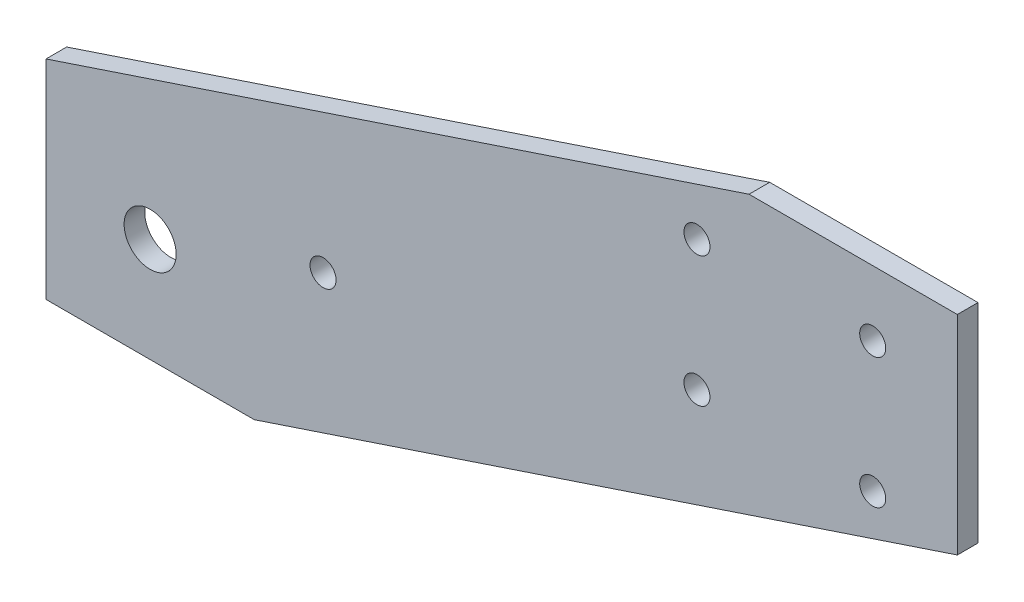
ISO-10303-21;
HEADER;
FILE_DESCRIPTION(('STEP AP214'),'2;1');
FILE_NAME('part.step','',(''),(''),'','','');
FILE_SCHEMA(('AUTOMOTIVE_DESIGN { 1 0 10303 214 1 1 1 1 }'));
ENDSEC;
DATA;
#1=APPLICATION_CONTEXT('core data for automotive mechanical design processes');
#2=APPLICATION_PROTOCOL_DEFINITION('international standard','automotive_design',2000,#1);
#3=PRODUCT_CONTEXT('',#1,'mechanical');
#4=PRODUCT('Part','Part','',(#3));
#5=PRODUCT_RELATED_PRODUCT_CATEGORY('part','',(#4));
#6=PRODUCT_DEFINITION_FORMATION('','',#4);
#7=PRODUCT_DEFINITION_CONTEXT('part definition',#1,'design');
#8=PRODUCT_DEFINITION('design','',#6,#7);
#9=PRODUCT_DEFINITION_SHAPE('','',#8);
#10=(LENGTH_UNIT() NAMED_UNIT(*) SI_UNIT(.MILLI.,.METRE.));
#11=(NAMED_UNIT(*) PLANE_ANGLE_UNIT() SI_UNIT($,.RADIAN.));
#12=(NAMED_UNIT(*) SI_UNIT($,.STERADIAN.) SOLID_ANGLE_UNIT());
#13=UNCERTAINTY_MEASURE_WITH_UNIT(LENGTH_MEASURE(1.E-05),#10,'distance_accuracy_value','');
#14=(GEOMETRIC_REPRESENTATION_CONTEXT(3) GLOBAL_UNCERTAINTY_ASSIGNED_CONTEXT((#13)) GLOBAL_UNIT_ASSIGNED_CONTEXT((#10,
#11,#12)) REPRESENTATION_CONTEXT('',''));
#15=CARTESIAN_POINT('',(0.,0.,0.));
#16=DIRECTION('',(0.,0.,1.));
#17=DIRECTION('',(1.,0.,0.));
#18=AXIS2_PLACEMENT_3D('',#15,#16,#17);
#19=CARTESIAN_POINT('',(110.,18.,-1.5875));
#20=DIRECTION('',(1.,0.,0.));
#21=DIRECTION('',(0.,0.,-1.));
#22=AXIS2_PLACEMENT_3D('',#19,#20,#21);
#23=PLANE('',#22);
#24=DIRECTION('',(0.,1.,0.));
#25=VECTOR('',#24,1.);
#26=CARTESIAN_POINT('',(110.,18.,0.));
#27=LINE('',#26,#25);
#28=CARTESIAN_POINT('',(110.,18.,0.));
#29=VERTEX_POINT('',#28);
#30=CARTESIAN_POINT('',(110.,34.,0.));
#31=VERTEX_POINT('',#30);
#32=EDGE_CURVE('E128',#29,#31,#27,.T.);
#33=ORIENTED_EDGE('',*,*,#32,.F.);
#34=DIRECTION('',(0.,0.,1.));
#35=VECTOR('',#34,1.);
#36=CARTESIAN_POINT('',(110.,18.,-1.5875));
#37=LINE('',#36,#35);
#38=CARTESIAN_POINT('',(110.,18.,-1.5875));
#39=VERTEX_POINT('',#38);
#40=EDGE_CURVE('E11',#39,#29,#37,.T.);
#41=ORIENTED_EDGE('',*,*,#40,.F.);
#42=DIRECTION('',(0.,1.,0.));
#43=VECTOR('',#42,1.);
#44=CARTESIAN_POINT('',(110.,18.,-1.5875));
#45=LINE('',#44,#43);
#46=CARTESIAN_POINT('',(110.,34.,-1.5875));
#47=VERTEX_POINT('',#46);
#48=EDGE_CURVE('E143',#39,#47,#45,.T.);
#49=ORIENTED_EDGE('',*,*,#48,.T.);
#50=DIRECTION('',(0.,0.,1.));
#51=VECTOR('',#50,1.);
#52=CARTESIAN_POINT('',(110.,34.,-1.5875));
#53=LINE('',#52,#51);
#54=EDGE_CURVE('E46',#47,#31,#53,.T.);
#55=ORIENTED_EDGE('',*,*,#54,.T.);
#56=EDGE_LOOP('',(#33,#41,#49,#55));
#57=FACE_BOUND('',#56,.T.);
#58=ADVANCED_FACE('F43',(#57),#23,.T.);
#59=CARTESIAN_POINT('',(110.,18.,-1.5875));
#60=DIRECTION('',(0.316227766016838,-0.948683298050514,0.));
#61=DIRECTION('',(0.948683298050514,0.316227766016838,0.));
#62=AXIS2_PLACEMENT_3D('',#59,#60,#61);
#63=PLANE('',#62);
#64=DIRECTION('',(0.948683298050514,0.316227766016838,0.));
#65=VECTOR('',#64,1.);
#66=CARTESIAN_POINT('',(110.,18.,0.));
#67=LINE('',#66,#65);
#68=CARTESIAN_POINT('',(56.,0.,0.));
#69=VERTEX_POINT('',#68);
#70=EDGE_CURVE('E141',#69,#29,#67,.T.);
#71=ORIENTED_EDGE('',*,*,#70,.F.);
#72=DIRECTION('',(0.,0.,1.));
#73=VECTOR('',#72,1.);
#74=CARTESIAN_POINT('',(56.,0.,-1.5875));
#75=LINE('',#74,#73);
#76=CARTESIAN_POINT('',(56.,0.,-1.5875));
#77=VERTEX_POINT('',#76);
#78=EDGE_CURVE('E52',#77,#69,#75,.T.);
#79=ORIENTED_EDGE('',*,*,#78,.F.);
#80=DIRECTION('',(0.948683298050514,0.316227766016838,0.));
#81=VECTOR('',#80,1.);
#82=CARTESIAN_POINT('',(110.,18.,-1.5875));
#83=LINE('',#82,#81);
#84=EDGE_CURVE('E118',#77,#39,#83,.T.);
#85=ORIENTED_EDGE('',*,*,#84,.T.);
#86=ORIENTED_EDGE('',*,*,#40,.T.);
#87=EDGE_LOOP('',(#71,#79,#85,#86));
#88=FACE_BOUND('',#87,.T.);
#89=ADVANCED_FACE('F151',(#88),#63,.T.);
#90=CARTESIAN_POINT('',(40.,0.,-1.5875));
#91=DIRECTION('',(0.,-1.,0.));
#92=DIRECTION('',(0.,0.,-1.));
#93=AXIS2_PLACEMENT_3D('',#90,#91,#92);
#94=PLANE('',#93);
#95=DIRECTION('',(1.,0.,0.));
#96=VECTOR('',#95,1.);
#97=CARTESIAN_POINT('',(40.,0.,0.));
#98=LINE('',#97,#96);
#99=CARTESIAN_POINT('',(40.,0.,0.));
#100=VERTEX_POINT('',#99);
#101=EDGE_CURVE('E105',#100,#69,#98,.T.);
#102=ORIENTED_EDGE('',*,*,#101,.F.);
#103=DIRECTION('',(0.,0.,1.));
#104=VECTOR('',#103,1.);
#105=CARTESIAN_POINT('',(40.,0.,-1.5875));
#106=LINE('',#105,#104);
#107=CARTESIAN_POINT('',(40.,0.,-1.5875));
#108=VERTEX_POINT('',#107);
#109=EDGE_CURVE('E100',#108,#100,#106,.T.);
#110=ORIENTED_EDGE('',*,*,#109,.F.);
#111=DIRECTION('',(1.,0.,0.));
#112=VECTOR('',#111,1.);
#113=CARTESIAN_POINT('',(40.,0.,-1.5875));
#114=LINE('',#113,#112);
#115=EDGE_CURVE('E103',#108,#77,#114,.T.);
#116=ORIENTED_EDGE('',*,*,#115,.T.);
#117=ORIENTED_EDGE('',*,*,#78,.T.);
#118=EDGE_LOOP('',(#102,#110,#116,#117));
#119=FACE_BOUND('',#118,.T.);
#120=ADVANCED_FACE('F102',(#119),#94,.T.);
#121=CARTESIAN_POINT('',(40.,16.,-1.5875));
#122=DIRECTION('',(-1.,0.,0.));
#123=DIRECTION('',(0.,0.,1.));
#124=AXIS2_PLACEMENT_3D('',#121,#122,#123);
#125=PLANE('',#124);
#126=DIRECTION('',(0.,-1.,0.));
#127=VECTOR('',#126,1.);
#128=CARTESIAN_POINT('',(40.,16.,0.));
#129=LINE('',#128,#127);
#130=CARTESIAN_POINT('',(40.,16.,0.));
#131=VERTEX_POINT('',#130);
#132=EDGE_CURVE('E138',#131,#100,#129,.T.);
#133=ORIENTED_EDGE('',*,*,#132,.F.);
#134=DIRECTION('',(0.,0.,1.));
#135=VECTOR('',#134,1.);
#136=CARTESIAN_POINT('',(40.,16.,-1.5875));
#137=LINE('',#136,#135);
#138=CARTESIAN_POINT('',(40.,16.,-1.5875));
#139=VERTEX_POINT('',#138);
#140=EDGE_CURVE('E110',#139,#131,#137,.T.);
#141=ORIENTED_EDGE('',*,*,#140,.F.);
#142=DIRECTION('',(0.,-1.,0.));
#143=VECTOR('',#142,1.);
#144=CARTESIAN_POINT('',(40.,16.,-1.5875));
#145=LINE('',#144,#143);
#146=EDGE_CURVE('E116',#139,#108,#145,.T.);
#147=ORIENTED_EDGE('',*,*,#146,.T.);
#148=ORIENTED_EDGE('',*,*,#109,.T.);
#149=EDGE_LOOP('',(#133,#141,#147,#148));
#150=FACE_BOUND('',#149,.T.);
#151=ADVANCED_FACE('F120',(#150),#125,.T.);
#152=CARTESIAN_POINT('',(94.,34.,-1.5875));
#153=DIRECTION('',(-0.316227766016838,0.948683298050514,0.));
#154=DIRECTION('',(-0.948683298050514,-0.316227766016838,0.));
#155=AXIS2_PLACEMENT_3D('',#152,#153,#154);
#156=PLANE('',#155);
#157=DIRECTION('',(-0.948683298050514,-0.316227766016838,0.));
#158=VECTOR('',#157,1.);
#159=CARTESIAN_POINT('',(94.,34.,0.));
#160=LINE('',#159,#158);
#161=CARTESIAN_POINT('',(94.,34.,0.));
#162=VERTEX_POINT('',#161);
#163=EDGE_CURVE('E135',#162,#131,#160,.T.);
#164=ORIENTED_EDGE('',*,*,#163,.F.);
#165=DIRECTION('',(0.,0.,1.));
#166=VECTOR('',#165,1.);
#167=CARTESIAN_POINT('',(94.,34.,-1.5875));
#168=LINE('',#167,#166);
#169=CARTESIAN_POINT('',(94.,34.,-1.5875));
#170=VERTEX_POINT('',#169);
#171=EDGE_CURVE('E146',#170,#162,#168,.T.);
#172=ORIENTED_EDGE('',*,*,#171,.F.);
#173=DIRECTION('',(-0.948683298050514,-0.316227766016838,0.));
#174=VECTOR('',#173,1.);
#175=CARTESIAN_POINT('',(94.,34.,-1.5875));
#176=LINE('',#175,#174);
#177=EDGE_CURVE('E121',#170,#139,#176,.T.);
#178=ORIENTED_EDGE('',*,*,#177,.T.);
#179=ORIENTED_EDGE('',*,*,#140,.T.);
#180=EDGE_LOOP('',(#164,#172,#178,#179));
#181=FACE_BOUND('',#180,.T.);
#182=ADVANCED_FACE('F164',(#181),#156,.T.);
#183=CARTESIAN_POINT('',(110.,34.,-1.5875));
#184=DIRECTION('',(0.,1.,0.));
#185=DIRECTION('',(-1.,0.,0.));
#186=AXIS2_PLACEMENT_3D('',#183,#184,#185);
#187=PLANE('',#186);
#188=DIRECTION('',(-1.,0.,0.));
#189=VECTOR('',#188,1.);
#190=CARTESIAN_POINT('',(110.,34.,0.));
#191=LINE('',#190,#189);
#192=EDGE_CURVE('E131',#31,#162,#191,.T.);
#193=ORIENTED_EDGE('',*,*,#192,.F.);
#194=ORIENTED_EDGE('',*,*,#54,.F.);
#195=DIRECTION('',(-1.,0.,0.));
#196=VECTOR('',#195,1.);
#197=CARTESIAN_POINT('',(110.,34.,-1.5875));
#198=LINE('',#197,#196);
#199=EDGE_CURVE('E123',#47,#170,#198,.T.);
#200=ORIENTED_EDGE('',*,*,#199,.T.);
#201=ORIENTED_EDGE('',*,*,#171,.T.);
#202=EDGE_LOOP('',(#193,#194,#200,#201));
#203=FACE_BOUND('',#202,.T.);
#204=ADVANCED_FACE('F148',(#203),#187,.T.);
#205=CARTESIAN_POINT('',(0.,0.,-1.5875));
#206=DIRECTION('',(0.,0.,1.));
#207=DIRECTION('',(1.,0.,0.));
#208=AXIS2_PLACEMENT_3D('',#205,#206,#207);
#209=PLANE('',#208);
#210=CARTESIAN_POINT('',(90.,19.,-1.5875));
#211=DIRECTION('',(0.,0.,1.));
#212=DIRECTION('',(1.,0.,0.));
#213=AXIS2_PLACEMENT_3D('',#210,#211,#212);
#214=CIRCLE('',#213,0.999999999999998);
#215=CARTESIAN_POINT('',(91.,19.,-1.5875));
#216=VERTEX_POINT('',#215);
#217=EDGE_CURVE('E206',#216,#216,#214,.T.);
#218=ORIENTED_EDGE('',*,*,#217,.T.);
#219=EDGE_LOOP('',(#218));
#220=FACE_BOUND('',#219,.T.);
#221=CARTESIAN_POINT('',(103.5,19.,-1.5875));
#222=DIRECTION('',(0.,0.,1.));
#223=DIRECTION('',(1.,0.,0.));
#224=AXIS2_PLACEMENT_3D('',#221,#222,#223);
#225=CIRCLE('',#224,0.999999999999998);
#226=CARTESIAN_POINT('',(104.5,19.,-1.5875));
#227=VERTEX_POINT('',#226);
#228=EDGE_CURVE('E214',#227,#227,#225,.T.);
#229=ORIENTED_EDGE('',*,*,#228,.T.);
#230=EDGE_LOOP('',(#229));
#231=FACE_BOUND('',#230,.T.);
#232=CARTESIAN_POINT('',(103.5,29.,-1.5875));
#233=DIRECTION('',(0.,0.,1.));
#234=DIRECTION('',(1.,0.,0.));
#235=AXIS2_PLACEMENT_3D('',#232,#233,#234);
#236=CIRCLE('',#235,0.999999999999998);
#237=CARTESIAN_POINT('',(104.5,29.,-1.5875));
#238=VERTEX_POINT('',#237);
#239=EDGE_CURVE('E220',#238,#238,#236,.T.);
#240=ORIENTED_EDGE('',*,*,#239,.T.);
#241=EDGE_LOOP('',(#240));
#242=FACE_BOUND('',#241,.T.);
#243=CARTESIAN_POINT('',(61.2815661727072,12.4271887242357,-1.5875));
#244=DIRECTION('',(0.,0.,1.));
#245=DIRECTION('',(1.,0.,0.));
#246=AXIS2_PLACEMENT_3D('',#243,#244,#245);
#247=CIRCLE('',#246,0.999999999999998);
#248=CARTESIAN_POINT('',(62.2815661727072,12.4271887242357,-1.5875));
#249=VERTEX_POINT('',#248);
#250=EDGE_CURVE('E226',#249,#249,#247,.T.);
#251=ORIENTED_EDGE('',*,*,#250,.T.);
#252=EDGE_LOOP('',(#251));
#253=FACE_BOUND('',#252,.T.);
#254=CARTESIAN_POINT('',(48.,8.,-1.5875));
#255=DIRECTION('',(0.,0.,1.));
#256=DIRECTION('',(1.,0.,0.));
#257=AXIS2_PLACEMENT_3D('',#254,#255,#256);
#258=CIRCLE('',#257,2.);
#259=CARTESIAN_POINT('',(50.,8.,-1.5875));
#260=VERTEX_POINT('',#259);
#261=EDGE_CURVE('E232',#260,#260,#258,.T.);
#262=ORIENTED_EDGE('',*,*,#261,.T.);
#263=EDGE_LOOP('',(#262));
#264=FACE_BOUND('',#263,.T.);
#265=CARTESIAN_POINT('',(90.,29.,-1.5875));
#266=DIRECTION('',(0.,0.,1.));
#267=DIRECTION('',(1.,0.,0.));
#268=AXIS2_PLACEMENT_3D('',#265,#266,#267);
#269=CIRCLE('',#268,0.999999999999998);
#270=CARTESIAN_POINT('',(91.,29.,-1.5875));
#271=VERTEX_POINT('',#270);
#272=EDGE_CURVE('E132',#271,#271,#269,.T.);
#273=ORIENTED_EDGE('',*,*,#272,.T.);
#274=EDGE_LOOP('',(#273));
#275=FACE_BOUND('',#274,.T.);
#276=ORIENTED_EDGE('',*,*,#48,.F.);
#277=ORIENTED_EDGE('',*,*,#84,.F.);
#278=ORIENTED_EDGE('',*,*,#115,.F.);
#279=ORIENTED_EDGE('',*,*,#146,.F.);
#280=ORIENTED_EDGE('',*,*,#177,.F.);
#281=ORIENTED_EDGE('',*,*,#199,.F.);
#282=EDGE_LOOP('',(#276,#277,#278,#279,#280,#281));
#283=FACE_BOUND('',#282,.T.);
#284=ADVANCED_FACE('F114',(#220,#231,#242,#253,#264,#275,#283),#209,.F.);
#285=CARTESIAN_POINT('',(0.,0.,0.));
#286=DIRECTION('',(0.,0.,1.));
#287=DIRECTION('',(1.,0.,0.));
#288=AXIS2_PLACEMENT_3D('',#285,#286,#287);
#289=PLANE('',#288);
#290=CARTESIAN_POINT('',(90.,19.,0.));
#291=DIRECTION('',(0.,0.,1.));
#292=DIRECTION('',(1.,0.,0.));
#293=AXIS2_PLACEMENT_3D('',#290,#291,#292);
#294=CIRCLE('',#293,0.999999999999998);
#295=CARTESIAN_POINT('',(91.,19.,0.));
#296=VERTEX_POINT('',#295);
#297=EDGE_CURVE('E209',#296,#296,#294,.T.);
#298=ORIENTED_EDGE('',*,*,#297,.F.);
#299=EDGE_LOOP('',(#298));
#300=FACE_BOUND('',#299,.T.);
#301=CARTESIAN_POINT('',(103.5,19.,0.));
#302=DIRECTION('',(0.,0.,1.));
#303=DIRECTION('',(1.,0.,0.));
#304=AXIS2_PLACEMENT_3D('',#301,#302,#303);
#305=CIRCLE('',#304,0.999999999999998);
#306=CARTESIAN_POINT('',(104.5,19.,0.));
#307=VERTEX_POINT('',#306);
#308=EDGE_CURVE('E211',#307,#307,#305,.T.);
#309=ORIENTED_EDGE('',*,*,#308,.F.);
#310=EDGE_LOOP('',(#309));
#311=FACE_BOUND('',#310,.T.);
#312=CARTESIAN_POINT('',(103.5,29.,0.));
#313=DIRECTION('',(0.,0.,1.));
#314=DIRECTION('',(1.,0.,0.));
#315=AXIS2_PLACEMENT_3D('',#312,#313,#314);
#316=CIRCLE('',#315,0.999999999999998);
#317=CARTESIAN_POINT('',(104.5,29.,0.));
#318=VERTEX_POINT('',#317);
#319=EDGE_CURVE('E217',#318,#318,#316,.T.);
#320=ORIENTED_EDGE('',*,*,#319,.F.);
#321=EDGE_LOOP('',(#320));
#322=FACE_BOUND('',#321,.T.);
#323=CARTESIAN_POINT('',(61.2815661727072,12.4271887242357,0.));
#324=DIRECTION('',(0.,0.,1.));
#325=DIRECTION('',(1.,0.,0.));
#326=AXIS2_PLACEMENT_3D('',#323,#324,#325);
#327=CIRCLE('',#326,0.999999999999998);
#328=CARTESIAN_POINT('',(62.2815661727072,12.4271887242357,0.));
#329=VERTEX_POINT('',#328);
#330=EDGE_CURVE('E223',#329,#329,#327,.T.);
#331=ORIENTED_EDGE('',*,*,#330,.F.);
#332=EDGE_LOOP('',(#331));
#333=FACE_BOUND('',#332,.T.);
#334=CARTESIAN_POINT('',(48.,8.,0.));
#335=DIRECTION('',(0.,0.,1.));
#336=DIRECTION('',(1.,0.,0.));
#337=AXIS2_PLACEMENT_3D('',#334,#335,#336);
#338=CIRCLE('',#337,2.);
#339=CARTESIAN_POINT('',(50.,8.,0.));
#340=VERTEX_POINT('',#339);
#341=EDGE_CURVE('E229',#340,#340,#338,.T.);
#342=ORIENTED_EDGE('',*,*,#341,.F.);
#343=EDGE_LOOP('',(#342));
#344=FACE_BOUND('',#343,.T.);
#345=CARTESIAN_POINT('',(90.,29.,0.));
#346=DIRECTION('',(0.,0.,1.));
#347=DIRECTION('',(1.,0.,0.));
#348=AXIS2_PLACEMENT_3D('',#345,#346,#347);
#349=CIRCLE('',#348,0.999999999999998);
#350=CARTESIAN_POINT('',(91.,29.,0.));
#351=VERTEX_POINT('',#350);
#352=EDGE_CURVE('E235',#351,#351,#349,.T.);
#353=ORIENTED_EDGE('',*,*,#352,.F.);
#354=EDGE_LOOP('',(#353));
#355=FACE_BOUND('',#354,.T.);
#356=ORIENTED_EDGE('',*,*,#32,.T.);
#357=ORIENTED_EDGE('',*,*,#192,.T.);
#358=ORIENTED_EDGE('',*,*,#163,.T.);
#359=ORIENTED_EDGE('',*,*,#132,.T.);
#360=ORIENTED_EDGE('',*,*,#101,.T.);
#361=ORIENTED_EDGE('',*,*,#70,.T.);
#362=EDGE_LOOP('',(#356,#357,#358,#359,#360,#361));
#363=FACE_BOUND('',#362,.T.);
#364=ADVANCED_FACE('F150',(#300,#311,#322,#333,#344,#355,#363),#289,.T.);
#365=CARTESIAN_POINT('',(90.,29.,-1.5875));
#366=DIRECTION('',(0.,0.,1.));
#367=DIRECTION('',(1.,0.,0.));
#368=AXIS2_PLACEMENT_3D('',#365,#366,#367);
#369=CYLINDRICAL_SURFACE('',#368,0.999999999999998);
#370=ORIENTED_EDGE('',*,*,#272,.F.);
#371=EDGE_LOOP('',(#370));
#372=FACE_BOUND('',#371,.T.);
#373=ORIENTED_EDGE('',*,*,#352,.T.);
#374=EDGE_LOOP('',(#373));
#375=FACE_BOUND('',#374,.T.);
#376=ADVANCED_FACE('F175',(#372,#375),#369,.F.);
#377=CARTESIAN_POINT('',(48.,8.,-1.5875));
#378=DIRECTION('',(0.,0.,1.));
#379=DIRECTION('',(1.,0.,0.));
#380=AXIS2_PLACEMENT_3D('',#377,#378,#379);
#381=CYLINDRICAL_SURFACE('',#380,2.);
#382=ORIENTED_EDGE('',*,*,#261,.F.);
#383=EDGE_LOOP('',(#382));
#384=FACE_BOUND('',#383,.T.);
#385=ORIENTED_EDGE('',*,*,#341,.T.);
#386=EDGE_LOOP('',(#385));
#387=FACE_BOUND('',#386,.T.);
#388=ADVANCED_FACE('F182',(#384,#387),#381,.F.);
#389=CARTESIAN_POINT('',(61.2815661727072,12.4271887242357,-1.5875));
#390=DIRECTION('',(0.,0.,1.));
#391=DIRECTION('',(1.,0.,0.));
#392=AXIS2_PLACEMENT_3D('',#389,#390,#391);
#393=CYLINDRICAL_SURFACE('',#392,0.999999999999998);
#394=ORIENTED_EDGE('',*,*,#250,.F.);
#395=EDGE_LOOP('',(#394));
#396=FACE_BOUND('',#395,.T.);
#397=ORIENTED_EDGE('',*,*,#330,.T.);
#398=EDGE_LOOP('',(#397));
#399=FACE_BOUND('',#398,.T.);
#400=ADVANCED_FACE('F186',(#396,#399),#393,.F.);
#401=CARTESIAN_POINT('',(103.5,29.,-1.5875));
#402=DIRECTION('',(0.,0.,1.));
#403=DIRECTION('',(1.,0.,0.));
#404=AXIS2_PLACEMENT_3D('',#401,#402,#403);
#405=CYLINDRICAL_SURFACE('',#404,0.999999999999998);
#406=ORIENTED_EDGE('',*,*,#239,.F.);
#407=EDGE_LOOP('',(#406));
#408=FACE_BOUND('',#407,.T.);
#409=ORIENTED_EDGE('',*,*,#319,.T.);
#410=EDGE_LOOP('',(#409));
#411=FACE_BOUND('',#410,.T.);
#412=ADVANCED_FACE('F190',(#408,#411),#405,.F.);
#413=CARTESIAN_POINT('',(103.5,19.,-1.5875));
#414=DIRECTION('',(0.,0.,1.));
#415=DIRECTION('',(1.,0.,0.));
#416=AXIS2_PLACEMENT_3D('',#413,#414,#415);
#417=CYLINDRICAL_SURFACE('',#416,0.999999999999998);
#418=ORIENTED_EDGE('',*,*,#228,.F.);
#419=EDGE_LOOP('',(#418));
#420=FACE_BOUND('',#419,.T.);
#421=ORIENTED_EDGE('',*,*,#308,.T.);
#422=EDGE_LOOP('',(#421));
#423=FACE_BOUND('',#422,.T.);
#424=ADVANCED_FACE('F194',(#420,#423),#417,.F.);
#425=CARTESIAN_POINT('',(90.,19.,-1.5875));
#426=DIRECTION('',(0.,0.,1.));
#427=DIRECTION('',(1.,0.,0.));
#428=AXIS2_PLACEMENT_3D('',#425,#426,#427);
#429=CYLINDRICAL_SURFACE('',#428,0.999999999999998);
#430=ORIENTED_EDGE('',*,*,#217,.F.);
#431=EDGE_LOOP('',(#430));
#432=FACE_BOUND('',#431,.T.);
#433=ORIENTED_EDGE('',*,*,#297,.T.);
#434=EDGE_LOOP('',(#433));
#435=FACE_BOUND('',#434,.T.);
#436=ADVANCED_FACE('F198',(#432,#435),#429,.F.);
#437=CLOSED_SHELL('',(#58,#89,#120,#151,#182,#204,#284,#364,#376,#388,#400,#412,#424,#436));
#438=MANIFOLD_SOLID_BREP('B2',#437);
#439=ADVANCED_BREP_SHAPE_REPRESENTATION('',(#18,#438),#14);
#440=SHAPE_DEFINITION_REPRESENTATION(#9,#439);
ENDSEC;
END-ISO-10303-21;
